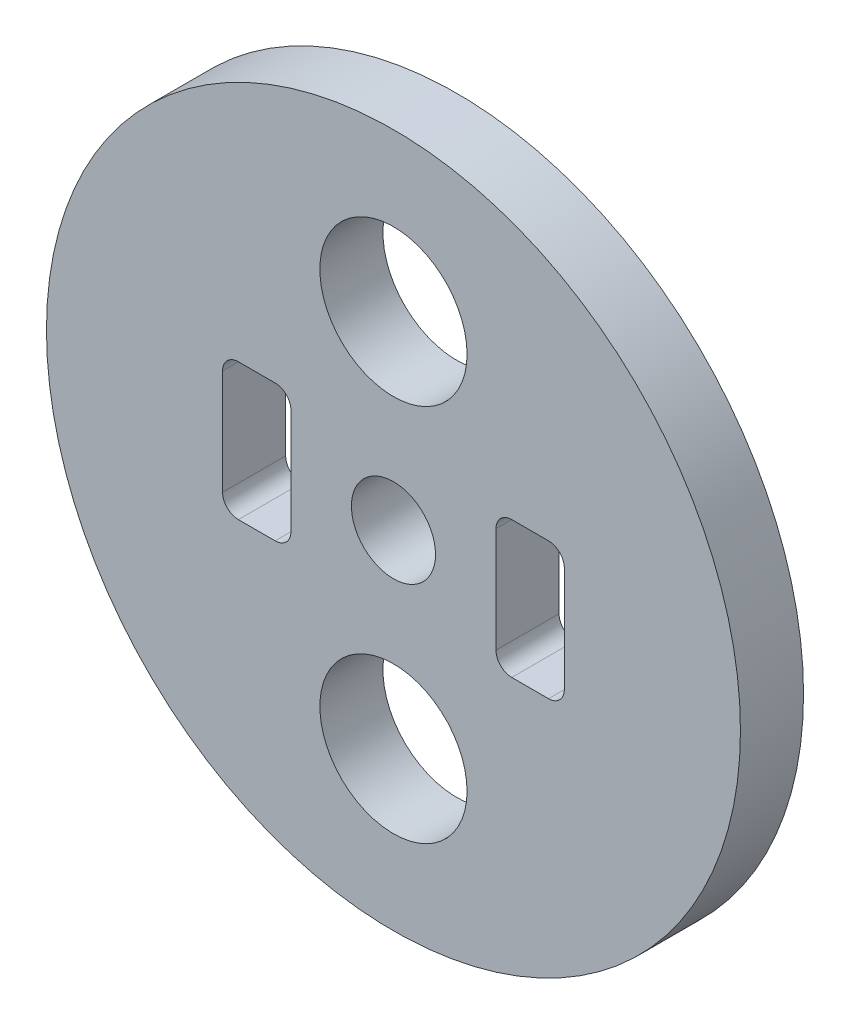
ISO-10303-21;
HEADER;
FILE_DESCRIPTION(('STEP AP214'),'2;1');
FILE_NAME('part.step','',(''),(''),'','','');
FILE_SCHEMA(('AUTOMOTIVE_DESIGN { 1 0 10303 214 1 1 1 1 }'));
ENDSEC;
DATA;
#1=APPLICATION_CONTEXT('core data for automotive mechanical design processes');
#2=APPLICATION_PROTOCOL_DEFINITION('international standard','automotive_design',2000,#1);
#3=PRODUCT_CONTEXT('',#1,'mechanical');
#4=PRODUCT('Part','Part','',(#3));
#5=PRODUCT_RELATED_PRODUCT_CATEGORY('part','',(#4));
#6=PRODUCT_DEFINITION_FORMATION('','',#4);
#7=PRODUCT_DEFINITION_CONTEXT('part definition',#1,'design');
#8=PRODUCT_DEFINITION('design','',#6,#7);
#9=PRODUCT_DEFINITION_SHAPE('','',#8);
#10=(LENGTH_UNIT() NAMED_UNIT(*) SI_UNIT(.MILLI.,.METRE.));
#11=(NAMED_UNIT(*) PLANE_ANGLE_UNIT() SI_UNIT($,.RADIAN.));
#12=(NAMED_UNIT(*) SI_UNIT($,.STERADIAN.) SOLID_ANGLE_UNIT());
#13=UNCERTAINTY_MEASURE_WITH_UNIT(LENGTH_MEASURE(1.E-05),#10,'distance_accuracy_value','');
#14=(GEOMETRIC_REPRESENTATION_CONTEXT(3) GLOBAL_UNCERTAINTY_ASSIGNED_CONTEXT((#13)) GLOBAL_UNIT_ASSIGNED_CONTEXT((#10,
#11,#12)) REPRESENTATION_CONTEXT('',''));
#15=CARTESIAN_POINT('',(0.,0.,0.));
#16=DIRECTION('',(0.,0.,1.));
#17=DIRECTION('',(1.,0.,0.));
#18=AXIS2_PLACEMENT_3D('',#15,#16,#17);
#19=CARTESIAN_POINT('',(210.1228079135,239.4520199932,3.));
#20=DIRECTION('',(0.,0.,-1.));
#21=DIRECTION('',(-1.,0.,0.));
#22=AXIS2_PLACEMENT_3D('',#19,#20,#21);
#23=CYLINDRICAL_SURFACE('',#22,0.750000000000001);
#24=CARTESIAN_POINT('',(210.1228079135,239.4520199932,0.));
#25=DIRECTION('',(0.,0.,1.));
#26=DIRECTION('',(1.,0.,0.));
#27=AXIS2_PLACEMENT_3D('',#24,#25,#26);
#28=CIRCLE('',#27,0.750000000000001);
#29=CARTESIAN_POINT('',(210.1228079135,238.7020199932,0.));
#30=VERTEX_POINT('',#29);
#31=CARTESIAN_POINT('',(210.8728079135,239.4520199932,0.));
#32=VERTEX_POINT('',#31);
#33=EDGE_CURVE('E218',#30,#32,#28,.T.);
#34=ORIENTED_EDGE('',*,*,#33,.F.);
#35=DIRECTION('',(0.,0.,-1.));
#36=VECTOR('',#35,1.);
#37=CARTESIAN_POINT('',(210.1228079135,238.7020199932,3.));
#38=LINE('',#37,#36);
#39=CARTESIAN_POINT('',(210.1228079135,238.7020199932,3.));
#40=VERTEX_POINT('',#39);
#41=EDGE_CURVE('E11',#40,#30,#38,.T.);
#42=ORIENTED_EDGE('',*,*,#41,.F.);
#43=CARTESIAN_POINT('',(210.1228079135,239.4520199932,3.));
#44=DIRECTION('',(0.,0.,1.));
#45=DIRECTION('',(1.,0.,0.));
#46=AXIS2_PLACEMENT_3D('',#43,#44,#45);
#47=CIRCLE('',#46,0.750000000000001);
#48=CARTESIAN_POINT('',(210.8728079135,239.4520199932,3.));
#49=VERTEX_POINT('',#48);
#50=EDGE_CURVE('E302',#40,#49,#47,.T.);
#51=ORIENTED_EDGE('',*,*,#50,.T.);
#52=DIRECTION('',(0.,0.,-1.));
#53=VECTOR('',#52,1.);
#54=CARTESIAN_POINT('',(210.8728079135,239.4520199932,3.));
#55=LINE('',#54,#53);
#56=EDGE_CURVE('E110',#49,#32,#55,.T.);
#57=ORIENTED_EDGE('',*,*,#56,.T.);
#58=EDGE_LOOP('',(#34,#42,#51,#57));
#59=FACE_BOUND('',#58,.T.);
#60=ADVANCED_FACE('F33',(#59),#23,.F.);
#61=CARTESIAN_POINT('',(0.,238.7020199932,3.));
#62=DIRECTION('',(0.,-1.,0.));
#63=DIRECTION('',(0.,0.,-1.));
#64=AXIS2_PLACEMENT_3D('',#61,#62,#63);
#65=PLANE('',#64);
#66=DIRECTION('',(-1.,0.,0.));
#67=VECTOR('',#66,1.);
#68=CARTESIAN_POINT('',(0.,238.7020199932,0.));
#69=LINE('',#68,#67);
#70=CARTESIAN_POINT('',(208.3728079135,238.7020199932,0.));
#71=VERTEX_POINT('',#70);
#72=EDGE_CURVE('E221',#30,#71,#69,.T.);
#73=ORIENTED_EDGE('',*,*,#72,.T.);
#74=DIRECTION('',(0.,0.,-1.));
#75=VECTOR('',#74,1.);
#76=CARTESIAN_POINT('',(208.3728079135,238.7020199932,3.));
#77=LINE('',#76,#75);
#78=CARTESIAN_POINT('',(208.3728079135,238.7020199932,3.));
#79=VERTEX_POINT('',#78);
#80=EDGE_CURVE('E43',#79,#71,#77,.T.);
#81=ORIENTED_EDGE('',*,*,#80,.F.);
#82=DIRECTION('',(-1.,0.,0.));
#83=VECTOR('',#82,1.);
#84=CARTESIAN_POINT('',(0.,238.7020199932,3.));
#85=LINE('',#84,#83);
#86=EDGE_CURVE('E304',#40,#79,#85,.T.);
#87=ORIENTED_EDGE('',*,*,#86,.F.);
#88=ORIENTED_EDGE('',*,*,#41,.T.);
#89=EDGE_LOOP('',(#73,#81,#87,#88));
#90=FACE_BOUND('',#89,.T.);
#91=ADVANCED_FACE('F322',(#90),#65,.F.);
#92=CARTESIAN_POINT('',(208.3728079135,239.4520199932,3.));
#93=DIRECTION('',(0.,0.,-1.));
#94=DIRECTION('',(-1.,0.,0.));
#95=AXIS2_PLACEMENT_3D('',#92,#93,#94);
#96=CYLINDRICAL_SURFACE('',#95,0.750000000000237);
#97=CARTESIAN_POINT('',(208.3728079135,239.4520199932,0.));
#98=DIRECTION('',(0.,0.,1.));
#99=DIRECTION('',(1.,0.,0.));
#100=AXIS2_PLACEMENT_3D('',#97,#98,#99);
#101=CIRCLE('',#100,0.750000000000237);
#102=CARTESIAN_POINT('',(207.6228079135,239.4520199932,0.));
#103=VERTEX_POINT('',#102);
#104=EDGE_CURVE('E224',#103,#71,#101,.T.);
#105=ORIENTED_EDGE('',*,*,#104,.F.);
#106=DIRECTION('',(0.,0.,-1.));
#107=VECTOR('',#106,1.);
#108=CARTESIAN_POINT('',(207.6228079135,239.4520199932,3.));
#109=LINE('',#108,#107);
#110=CARTESIAN_POINT('',(207.6228079135,239.4520199932,3.));
#111=VERTEX_POINT('',#110);
#112=EDGE_CURVE('E247',#111,#103,#109,.T.);
#113=ORIENTED_EDGE('',*,*,#112,.F.);
#114=CARTESIAN_POINT('',(208.3728079135,239.4520199932,3.));
#115=DIRECTION('',(0.,0.,1.));
#116=DIRECTION('',(1.,0.,0.));
#117=AXIS2_PLACEMENT_3D('',#114,#115,#116);
#118=CIRCLE('',#117,0.750000000000237);
#119=EDGE_CURVE('E306',#111,#79,#118,.T.);
#120=ORIENTED_EDGE('',*,*,#119,.T.);
#121=ORIENTED_EDGE('',*,*,#80,.T.);
#122=EDGE_LOOP('',(#105,#113,#120,#121));
#123=FACE_BOUND('',#122,.T.);
#124=ADVANCED_FACE('F325',(#123),#96,.F.);
#125=CARTESIAN_POINT('',(207.6228079135,0.,3.));
#126=DIRECTION('',(-1.,0.,0.));
#127=DIRECTION('',(0.,0.,1.));
#128=AXIS2_PLACEMENT_3D('',#125,#126,#127);
#129=PLANE('',#128);
#130=DIRECTION('',(0.,1.,0.));
#131=VECTOR('',#130,1.);
#132=CARTESIAN_POINT('',(207.6228079135,0.,0.));
#133=LINE('',#132,#131);
#134=CARTESIAN_POINT('',(207.6228079135,244.4520199932,0.));
#135=VERTEX_POINT('',#134);
#136=EDGE_CURVE('E227',#103,#135,#133,.T.);
#137=ORIENTED_EDGE('',*,*,#136,.T.);
#138=DIRECTION('',(0.,0.,-1.));
#139=VECTOR('',#138,1.);
#140=CARTESIAN_POINT('',(207.6228079135,244.4520199932,3.));
#141=LINE('',#140,#139);
#142=CARTESIAN_POINT('',(207.6228079135,244.4520199932,3.));
#143=VERTEX_POINT('',#142);
#144=EDGE_CURVE('E245',#143,#135,#141,.T.);
#145=ORIENTED_EDGE('',*,*,#144,.F.);
#146=DIRECTION('',(0.,1.,0.));
#147=VECTOR('',#146,1.);
#148=CARTESIAN_POINT('',(207.6228079135,0.,3.));
#149=LINE('',#148,#147);
#150=EDGE_CURVE('E309',#111,#143,#149,.T.);
#151=ORIENTED_EDGE('',*,*,#150,.F.);
#152=ORIENTED_EDGE('',*,*,#112,.T.);
#153=EDGE_LOOP('',(#137,#145,#151,#152));
#154=FACE_BOUND('',#153,.T.);
#155=ADVANCED_FACE('F328',(#154),#129,.F.);
#156=CARTESIAN_POINT('',(208.3728079135,244.4520199932,3.));
#157=DIRECTION('',(0.,0.,-1.));
#158=DIRECTION('',(-1.,0.,0.));
#159=AXIS2_PLACEMENT_3D('',#156,#157,#158);
#160=CYLINDRICAL_SURFACE('',#159,0.750000000000001);
#161=CARTESIAN_POINT('',(208.3728079135,244.4520199932,0.));
#162=DIRECTION('',(0.,0.,1.));
#163=DIRECTION('',(1.,0.,0.));
#164=AXIS2_PLACEMENT_3D('',#161,#162,#163);
#165=CIRCLE('',#164,0.750000000000001);
#166=CARTESIAN_POINT('',(208.3728079135,245.2020199932,0.));
#167=VERTEX_POINT('',#166);
#168=EDGE_CURVE('E230',#167,#135,#165,.T.);
#169=ORIENTED_EDGE('',*,*,#168,.F.);
#170=DIRECTION('',(0.,0.,-1.));
#171=VECTOR('',#170,1.);
#172=CARTESIAN_POINT('',(208.3728079135,245.2020199932,3.));
#173=LINE('',#172,#171);
#174=CARTESIAN_POINT('',(208.3728079135,245.2020199932,3.));
#175=VERTEX_POINT('',#174);
#176=EDGE_CURVE('E174',#175,#167,#173,.T.);
#177=ORIENTED_EDGE('',*,*,#176,.F.);
#178=CARTESIAN_POINT('',(208.3728079135,244.4520199932,3.));
#179=DIRECTION('',(0.,0.,1.));
#180=DIRECTION('',(1.,0.,0.));
#181=AXIS2_PLACEMENT_3D('',#178,#179,#180);
#182=CIRCLE('',#181,0.750000000000001);
#183=EDGE_CURVE('E163',#175,#143,#182,.T.);
#184=ORIENTED_EDGE('',*,*,#183,.T.);
#185=ORIENTED_EDGE('',*,*,#144,.T.);
#186=EDGE_LOOP('',(#169,#177,#184,#185));
#187=FACE_BOUND('',#186,.T.);
#188=ADVANCED_FACE('F312',(#187),#160,.F.);
#189=CARTESIAN_POINT('',(0.,245.2020199932,3.));
#190=DIRECTION('',(0.,1.,0.));
#191=DIRECTION('',(0.,0.,1.));
#192=AXIS2_PLACEMENT_3D('',#189,#190,#191);
#193=PLANE('',#192);
#194=DIRECTION('',(1.,0.,0.));
#195=VECTOR('',#194,1.);
#196=CARTESIAN_POINT('',(0.,245.2020199932,0.));
#197=LINE('',#196,#195);
#198=CARTESIAN_POINT('',(210.1228079135,245.2020199932,0.));
#199=VERTEX_POINT('',#198);
#200=EDGE_CURVE('E170',#167,#199,#197,.T.);
#201=ORIENTED_EDGE('',*,*,#200,.T.);
#202=DIRECTION('',(0.,0.,-1.));
#203=VECTOR('',#202,1.);
#204=CARTESIAN_POINT('',(210.1228079135,245.2020199932,3.));
#205=LINE('',#204,#203);
#206=CARTESIAN_POINT('',(210.1228079135,245.2020199932,3.));
#207=VERTEX_POINT('',#206);
#208=EDGE_CURVE('E167',#207,#199,#205,.T.);
#209=ORIENTED_EDGE('',*,*,#208,.F.);
#210=DIRECTION('',(1.,0.,0.));
#211=VECTOR('',#210,1.);
#212=CARTESIAN_POINT('',(0.,245.2020199932,3.));
#213=LINE('',#212,#211);
#214=EDGE_CURVE('E156',#175,#207,#213,.T.);
#215=ORIENTED_EDGE('',*,*,#214,.F.);
#216=ORIENTED_EDGE('',*,*,#176,.T.);
#217=EDGE_LOOP('',(#201,#209,#215,#216));
#218=FACE_BOUND('',#217,.T.);
#219=ADVANCED_FACE('F168',(#218),#193,.F.);
#220=CARTESIAN_POINT('',(210.1228079135,244.4520199932,3.));
#221=DIRECTION('',(0.,0.,-1.));
#222=DIRECTION('',(-1.,0.,0.));
#223=AXIS2_PLACEMENT_3D('',#220,#221,#222);
#224=CYLINDRICAL_SURFACE('',#223,0.750000000000001);
#225=CARTESIAN_POINT('',(210.1228079135,244.4520199932,0.));
#226=DIRECTION('',(0.,0.,1.));
#227=DIRECTION('',(1.,0.,0.));
#228=AXIS2_PLACEMENT_3D('',#225,#226,#227);
#229=CIRCLE('',#228,0.750000000000001);
#230=CARTESIAN_POINT('',(210.8728079135,244.4520199932,0.));
#231=VERTEX_POINT('',#230);
#232=EDGE_CURVE('E234',#231,#199,#229,.T.);
#233=ORIENTED_EDGE('',*,*,#232,.F.);
#234=DIRECTION('',(0.,0.,-1.));
#235=VECTOR('',#234,1.);
#236=CARTESIAN_POINT('',(210.8728079135,244.4520199932,3.));
#237=LINE('',#236,#235);
#238=CARTESIAN_POINT('',(210.8728079135,244.4520199932,3.));
#239=VERTEX_POINT('',#238);
#240=EDGE_CURVE('E103',#239,#231,#237,.T.);
#241=ORIENTED_EDGE('',*,*,#240,.F.);
#242=CARTESIAN_POINT('',(210.1228079135,244.4520199932,3.));
#243=DIRECTION('',(0.,0.,1.));
#244=DIRECTION('',(1.,0.,0.));
#245=AXIS2_PLACEMENT_3D('',#242,#243,#244);
#246=CIRCLE('',#245,0.750000000000001);
#247=EDGE_CURVE('E161',#239,#207,#246,.T.);
#248=ORIENTED_EDGE('',*,*,#247,.T.);
#249=ORIENTED_EDGE('',*,*,#208,.T.);
#250=EDGE_LOOP('',(#233,#241,#248,#249));
#251=FACE_BOUND('',#250,.T.);
#252=ADVANCED_FACE('F176',(#251),#224,.F.);
#253=CARTESIAN_POINT('',(221.3728079135,239.4520199932,3.));
#254=DIRECTION('',(0.,0.,-1.));
#255=DIRECTION('',(-1.,0.,0.));
#256=AXIS2_PLACEMENT_3D('',#253,#254,#255);
#257=CYLINDRICAL_SURFACE('',#256,0.750000000000001);
#258=CARTESIAN_POINT('',(221.3728079135,239.4520199932,0.));
#259=DIRECTION('',(0.,0.,1.));
#260=DIRECTION('',(1.,0.,0.));
#261=AXIS2_PLACEMENT_3D('',#258,#259,#260);
#262=CIRCLE('',#261,0.750000000000001);
#263=CARTESIAN_POINT('',(220.6228079135,239.4520199932,0.));
#264=VERTEX_POINT('',#263);
#265=CARTESIAN_POINT('',(221.3728079135,238.7020199932,0.));
#266=VERTEX_POINT('',#265);
#267=EDGE_CURVE('E194',#264,#266,#262,.T.);
#268=ORIENTED_EDGE('',*,*,#267,.F.);
#269=DIRECTION('',(0.,0.,-1.));
#270=VECTOR('',#269,1.);
#271=CARTESIAN_POINT('',(220.6228079135,239.4520199932,3.));
#272=LINE('',#271,#270);
#273=CARTESIAN_POINT('',(220.6228079135,239.4520199932,3.));
#274=VERTEX_POINT('',#273);
#275=EDGE_CURVE('E37',#274,#264,#272,.T.);
#276=ORIENTED_EDGE('',*,*,#275,.F.);
#277=CARTESIAN_POINT('',(221.3728079135,239.4520199932,3.));
#278=DIRECTION('',(0.,0.,1.));
#279=DIRECTION('',(1.,0.,0.));
#280=AXIS2_PLACEMENT_3D('',#277,#278,#279);
#281=CIRCLE('',#280,0.750000000000001);
#282=CARTESIAN_POINT('',(221.3728079135,238.7020199932,3.));
#283=VERTEX_POINT('',#282);
#284=EDGE_CURVE('E541',#274,#283,#281,.T.);
#285=ORIENTED_EDGE('',*,*,#284,.T.);
#286=DIRECTION('',(0.,0.,-1.));
#287=VECTOR('',#286,1.);
#288=CARTESIAN_POINT('',(221.3728079135,238.7020199932,3.));
#289=LINE('',#288,#287);
#290=EDGE_CURVE('E184',#283,#266,#289,.T.);
#291=ORIENTED_EDGE('',*,*,#290,.T.);
#292=EDGE_LOOP('',(#268,#276,#285,#291));
#293=FACE_BOUND('',#292,.T.);
#294=ADVANCED_FACE('F270',(#293),#257,.F.);
#295=CARTESIAN_POINT('',(220.6228079135,0.,3.));
#296=DIRECTION('',(1.,0.,0.));
#297=DIRECTION('',(0.,0.,-1.));
#298=AXIS2_PLACEMENT_3D('',#295,#296,#297);
#299=PLANE('',#298);
#300=DIRECTION('',(0.,-1.,0.));
#301=VECTOR('',#300,1.);
#302=CARTESIAN_POINT('',(220.6228079135,0.,0.));
#303=LINE('',#302,#301);
#304=CARTESIAN_POINT('',(220.6228079135,244.4520199932,0.));
#305=VERTEX_POINT('',#304);
#306=EDGE_CURVE('E197',#305,#264,#303,.T.);
#307=ORIENTED_EDGE('',*,*,#306,.F.);
#308=DIRECTION('',(0.,0.,-1.));
#309=VECTOR('',#308,1.);
#310=CARTESIAN_POINT('',(220.6228079135,244.4520199932,3.));
#311=LINE('',#310,#309);
#312=CARTESIAN_POINT('',(220.6228079135,244.4520199932,3.));
#313=VERTEX_POINT('',#312);
#314=EDGE_CURVE('E260',#313,#305,#311,.T.);
#315=ORIENTED_EDGE('',*,*,#314,.F.);
#316=DIRECTION('',(0.,-1.,0.));
#317=VECTOR('',#316,1.);
#318=CARTESIAN_POINT('',(220.6228079135,0.,3.));
#319=LINE('',#318,#317);
#320=EDGE_CURVE('E269',#313,#274,#319,.T.);
#321=ORIENTED_EDGE('',*,*,#320,.T.);
#322=ORIENTED_EDGE('',*,*,#275,.T.);
#323=EDGE_LOOP('',(#307,#315,#321,#322));
#324=FACE_BOUND('',#323,.T.);
#325=ADVANCED_FACE('F267',(#324),#299,.T.);
#326=CARTESIAN_POINT('',(221.3728079135,244.4520199932,3.));
#327=DIRECTION('',(0.,0.,-1.));
#328=DIRECTION('',(-1.,0.,0.));
#329=AXIS2_PLACEMENT_3D('',#326,#327,#328);
#330=CYLINDRICAL_SURFACE('',#329,0.750000000000001);
#331=CARTESIAN_POINT('',(221.3728079135,244.4520199932,0.));
#332=DIRECTION('',(0.,0.,1.));
#333=DIRECTION('',(1.,0.,0.));
#334=AXIS2_PLACEMENT_3D('',#331,#332,#333);
#335=CIRCLE('',#334,0.750000000000001);
#336=CARTESIAN_POINT('',(221.3728079135,245.2020199932,0.));
#337=VERTEX_POINT('',#336);
#338=EDGE_CURVE('E200',#337,#305,#335,.T.);
#339=ORIENTED_EDGE('',*,*,#338,.F.);
#340=DIRECTION('',(0.,0.,-1.));
#341=VECTOR('',#340,1.);
#342=CARTESIAN_POINT('',(221.3728079135,245.2020199932,3.));
#343=LINE('',#342,#341);
#344=CARTESIAN_POINT('',(221.3728079135,245.2020199932,3.));
#345=VERTEX_POINT('',#344);
#346=EDGE_CURVE('E259',#345,#337,#343,.T.);
#347=ORIENTED_EDGE('',*,*,#346,.F.);
#348=CARTESIAN_POINT('',(221.3728079135,244.4520199932,3.));
#349=DIRECTION('',(0.,0.,1.));
#350=DIRECTION('',(1.,0.,0.));
#351=AXIS2_PLACEMENT_3D('',#348,#349,#350);
#352=CIRCLE('',#351,0.750000000000001);
#353=EDGE_CURVE('E278',#345,#313,#352,.T.);
#354=ORIENTED_EDGE('',*,*,#353,.T.);
#355=ORIENTED_EDGE('',*,*,#314,.T.);
#356=EDGE_LOOP('',(#339,#347,#354,#355));
#357=FACE_BOUND('',#356,.T.);
#358=ADVANCED_FACE('F276',(#357),#330,.F.);
#359=CARTESIAN_POINT('',(0.,245.2020199932,3.));
#360=DIRECTION('',(0.,-1.,0.));
#361=DIRECTION('',(0.,0.,-1.));
#362=AXIS2_PLACEMENT_3D('',#359,#360,#361);
#363=PLANE('',#362);
#364=DIRECTION('',(-1.,0.,0.));
#365=VECTOR('',#364,1.);
#366=CARTESIAN_POINT('',(0.,245.2020199932,0.));
#367=LINE('',#366,#365);
#368=CARTESIAN_POINT('',(223.1228079135,245.2020199932,0.));
#369=VERTEX_POINT('',#368);
#370=EDGE_CURVE('E203',#369,#337,#367,.T.);
#371=ORIENTED_EDGE('',*,*,#370,.F.);
#372=DIRECTION('',(0.,0.,-1.));
#373=VECTOR('',#372,1.);
#374=CARTESIAN_POINT('',(223.1228079135,245.2020199932,3.));
#375=LINE('',#374,#373);
#376=CARTESIAN_POINT('',(223.1228079135,245.2020199932,3.));
#377=VERTEX_POINT('',#376);
#378=EDGE_CURVE('E257',#377,#369,#375,.T.);
#379=ORIENTED_EDGE('',*,*,#378,.F.);
#380=DIRECTION('',(-1.,0.,0.));
#381=VECTOR('',#380,1.);
#382=CARTESIAN_POINT('',(0.,245.2020199932,3.));
#383=LINE('',#382,#381);
#384=EDGE_CURVE('E284',#377,#345,#383,.T.);
#385=ORIENTED_EDGE('',*,*,#384,.T.);
#386=ORIENTED_EDGE('',*,*,#346,.T.);
#387=EDGE_LOOP('',(#371,#379,#385,#386));
#388=FACE_BOUND('',#387,.T.);
#389=ADVANCED_FACE('F287',(#388),#363,.T.);
#390=CARTESIAN_POINT('',(223.1228079135,244.4520199932,3.));
#391=DIRECTION('',(0.,0.,-1.));
#392=DIRECTION('',(-1.,0.,0.));
#393=AXIS2_PLACEMENT_3D('',#390,#391,#392);
#394=CYLINDRICAL_SURFACE('',#393,0.750000000000001);
#395=CARTESIAN_POINT('',(223.1228079135,244.4520199932,0.));
#396=DIRECTION('',(0.,0.,1.));
#397=DIRECTION('',(1.,0.,0.));
#398=AXIS2_PLACEMENT_3D('',#395,#396,#397);
#399=CIRCLE('',#398,0.750000000000001);
#400=CARTESIAN_POINT('',(223.8728079135,244.4520199932,0.));
#401=VERTEX_POINT('',#400);
#402=EDGE_CURVE('E206',#401,#369,#399,.T.);
#403=ORIENTED_EDGE('',*,*,#402,.F.);
#404=DIRECTION('',(0.,0.,-1.));
#405=VECTOR('',#404,1.);
#406=CARTESIAN_POINT('',(223.8728079135,244.4520199932,3.));
#407=LINE('',#406,#405);
#408=CARTESIAN_POINT('',(223.8728079135,244.4520199932,3.));
#409=VERTEX_POINT('',#408);
#410=EDGE_CURVE('E255',#409,#401,#407,.T.);
#411=ORIENTED_EDGE('',*,*,#410,.F.);
#412=CARTESIAN_POINT('',(223.1228079135,244.4520199932,3.));
#413=DIRECTION('',(0.,0.,1.));
#414=DIRECTION('',(1.,0.,0.));
#415=AXIS2_PLACEMENT_3D('',#412,#413,#414);
#416=CIRCLE('',#415,0.750000000000001);
#417=EDGE_CURVE('E288',#409,#377,#416,.T.);
#418=ORIENTED_EDGE('',*,*,#417,.T.);
#419=ORIENTED_EDGE('',*,*,#378,.T.);
#420=EDGE_LOOP('',(#403,#411,#418,#419));
#421=FACE_BOUND('',#420,.T.);
#422=ADVANCED_FACE('F356',(#421),#394,.F.);
#423=CARTESIAN_POINT('',(223.8728079135,0.,3.));
#424=DIRECTION('',(-1.,0.,0.));
#425=DIRECTION('',(0.,0.,1.));
#426=AXIS2_PLACEMENT_3D('',#423,#424,#425);
#427=PLANE('',#426);
#428=DIRECTION('',(0.,1.,0.));
#429=VECTOR('',#428,1.);
#430=CARTESIAN_POINT('',(223.8728079135,0.,0.));
#431=LINE('',#430,#429);
#432=CARTESIAN_POINT('',(223.8728079135,239.4520199932,0.));
#433=VERTEX_POINT('',#432);
#434=EDGE_CURVE('E209',#433,#401,#431,.T.);
#435=ORIENTED_EDGE('',*,*,#434,.F.);
#436=DIRECTION('',(0.,0.,-1.));
#437=VECTOR('',#436,1.);
#438=CARTESIAN_POINT('',(223.8728079135,239.4520199932,3.));
#439=LINE('',#438,#437);
#440=CARTESIAN_POINT('',(223.8728079135,239.4520199932,3.));
#441=VERTEX_POINT('',#440);
#442=EDGE_CURVE('E253',#441,#433,#439,.T.);
#443=ORIENTED_EDGE('',*,*,#442,.F.);
#444=DIRECTION('',(0.,1.,0.));
#445=VECTOR('',#444,1.);
#446=CARTESIAN_POINT('',(223.8728079135,0.,3.));
#447=LINE('',#446,#445);
#448=EDGE_CURVE('E290',#441,#409,#447,.T.);
#449=ORIENTED_EDGE('',*,*,#448,.T.);
#450=ORIENTED_EDGE('',*,*,#410,.T.);
#451=EDGE_LOOP('',(#435,#443,#449,#450));
#452=FACE_BOUND('',#451,.T.);
#453=ADVANCED_FACE('F352',(#452),#427,.T.);
#454=CARTESIAN_POINT('',(223.1228079135,239.4520199932,3.));
#455=DIRECTION('',(0.,0.,-1.));
#456=DIRECTION('',(-1.,0.,0.));
#457=AXIS2_PLACEMENT_3D('',#454,#455,#456);
#458=CYLINDRICAL_SURFACE('',#457,0.750000000000001);
#459=CARTESIAN_POINT('',(223.1228079135,239.4520199932,0.));
#460=DIRECTION('',(0.,0.,1.));
#461=DIRECTION('',(1.,0.,0.));
#462=AXIS2_PLACEMENT_3D('',#459,#460,#461);
#463=CIRCLE('',#462,0.750000000000001);
#464=CARTESIAN_POINT('',(223.1228079135,238.7020199932,0.));
#465=VERTEX_POINT('',#464);
#466=EDGE_CURVE('E212',#465,#433,#463,.T.);
#467=ORIENTED_EDGE('',*,*,#466,.F.);
#468=DIRECTION('',(0.,0.,-1.));
#469=VECTOR('',#468,1.);
#470=CARTESIAN_POINT('',(223.1228079135,238.7020199932,3.));
#471=LINE('',#470,#469);
#472=CARTESIAN_POINT('',(223.1228079135,238.7020199932,3.));
#473=VERTEX_POINT('',#472);
#474=EDGE_CURVE('E251',#473,#465,#471,.T.);
#475=ORIENTED_EDGE('',*,*,#474,.F.);
#476=CARTESIAN_POINT('',(223.1228079135,239.4520199932,3.));
#477=DIRECTION('',(0.,0.,1.));
#478=DIRECTION('',(1.,0.,0.));
#479=AXIS2_PLACEMENT_3D('',#476,#477,#478);
#480=CIRCLE('',#479,0.750000000000001);
#481=EDGE_CURVE('E296',#473,#441,#480,.T.);
#482=ORIENTED_EDGE('',*,*,#481,.T.);
#483=ORIENTED_EDGE('',*,*,#442,.T.);
#484=EDGE_LOOP('',(#467,#475,#482,#483));
#485=FACE_BOUND('',#484,.T.);
#486=ADVANCED_FACE('F349',(#485),#458,.F.);
#487=CARTESIAN_POINT('',(210.8728079135,0.,3.));
#488=DIRECTION('',(1.,0.,0.));
#489=DIRECTION('',(0.,0.,-1.));
#490=AXIS2_PLACEMENT_3D('',#487,#488,#489);
#491=PLANE('',#490);
#492=DIRECTION('',(0.,-1.,0.));
#493=VECTOR('',#492,1.);
#494=CARTESIAN_POINT('',(210.8728079135,0.,0.));
#495=LINE('',#494,#493);
#496=EDGE_CURVE('E236',#231,#32,#495,.T.);
#497=ORIENTED_EDGE('',*,*,#496,.T.);
#498=ORIENTED_EDGE('',*,*,#56,.F.);
#499=DIRECTION('',(0.,-1.,0.));
#500=VECTOR('',#499,1.);
#501=CARTESIAN_POINT('',(210.8728079135,0.,3.));
#502=LINE('',#501,#500);
#503=EDGE_CURVE('E52',#239,#49,#502,.T.);
#504=ORIENTED_EDGE('',*,*,#503,.F.);
#505=ORIENTED_EDGE('',*,*,#240,.T.);
#506=EDGE_LOOP('',(#497,#498,#504,#505));
#507=FACE_BOUND('',#506,.T.);
#508=ADVANCED_FACE('F317',(#507),#491,.F.);
#509=CARTESIAN_POINT('',(0.,238.7020199932,3.));
#510=DIRECTION('',(0.,1.,0.));
#511=DIRECTION('',(0.,0.,1.));
#512=AXIS2_PLACEMENT_3D('',#509,#510,#511);
#513=PLANE('',#512);
#514=DIRECTION('',(1.,0.,0.));
#515=VECTOR('',#514,1.);
#516=CARTESIAN_POINT('',(0.,238.7020199932,0.));
#517=LINE('',#516,#515);
#518=EDGE_CURVE('E215',#266,#465,#517,.T.);
#519=ORIENTED_EDGE('',*,*,#518,.F.);
#520=ORIENTED_EDGE('',*,*,#290,.F.);
#521=DIRECTION('',(1.,0.,0.));
#522=VECTOR('',#521,1.);
#523=CARTESIAN_POINT('',(0.,238.7020199932,3.));
#524=LINE('',#523,#522);
#525=EDGE_CURVE('E299',#283,#473,#524,.T.);
#526=ORIENTED_EDGE('',*,*,#525,.T.);
#527=ORIENTED_EDGE('',*,*,#474,.T.);
#528=EDGE_LOOP('',(#519,#520,#526,#527));
#529=FACE_BOUND('',#528,.T.);
#530=ADVANCED_FACE('F344',(#529),#513,.T.);
#531=CARTESIAN_POINT('',(215.7478079135,241.9520199932,3.));
#532=DIRECTION('',(0.,0.,-1.));
#533=DIRECTION('',(-1.,0.,0.));
#534=AXIS2_PLACEMENT_3D('',#531,#532,#533);
#535=CYLINDRICAL_SURFACE('',#534,2.);
#536=CARTESIAN_POINT('',(215.7478079135,241.9520199932,3.));
#537=DIRECTION('',(0.,0.,1.));
#538=DIRECTION('',(1.,0.,0.));
#539=AXIS2_PLACEMENT_3D('',#536,#537,#538);
#540=CIRCLE('',#539,2.);
#541=CARTESIAN_POINT('',(217.7478079135,241.9520199932,3.));
#542=VERTEX_POINT('',#541);
#543=EDGE_CURVE('E540',#542,#542,#540,.T.);
#544=ORIENTED_EDGE('',*,*,#543,.T.);
#545=EDGE_LOOP('',(#544));
#546=FACE_BOUND('',#545,.T.);
#547=CARTESIAN_POINT('',(215.7478079135,241.9520199932,0.));
#548=DIRECTION('',(0.,0.,1.));
#549=DIRECTION('',(1.,0.,0.));
#550=AXIS2_PLACEMENT_3D('',#547,#548,#549);
#551=CIRCLE('',#550,2.);
#552=CARTESIAN_POINT('',(217.7478079135,241.9520199932,0.));
#553=VERTEX_POINT('',#552);
#554=EDGE_CURVE('E191',#553,#553,#551,.T.);
#555=ORIENTED_EDGE('',*,*,#554,.F.);
#556=EDGE_LOOP('',(#555));
#557=FACE_BOUND('',#556,.T.);
#558=ADVANCED_FACE('F347',(#546,#557),#535,.F.);
#559=CARTESIAN_POINT('',(215.7478079135,250.9520199932,3.));
#560=DIRECTION('',(0.,0.,-1.));
#561=DIRECTION('',(-1.,0.,0.));
#562=AXIS2_PLACEMENT_3D('',#559,#560,#561);
#563=CYLINDRICAL_SURFACE('',#562,3.5);
#564=CARTESIAN_POINT('',(215.7478079135,250.9520199932,3.));
#565=DIRECTION('',(0.,0.,1.));
#566=DIRECTION('',(1.,0.,0.));
#567=AXIS2_PLACEMENT_3D('',#564,#565,#566);
#568=CIRCLE('',#567,3.5);
#569=CARTESIAN_POINT('',(219.2478079135,250.9520199932,3.));
#570=VERTEX_POINT('',#569);
#571=EDGE_CURVE('E382',#570,#570,#568,.T.);
#572=ORIENTED_EDGE('',*,*,#571,.T.);
#573=EDGE_LOOP('',(#572));
#574=FACE_BOUND('',#573,.T.);
#575=CARTESIAN_POINT('',(215.7478079135,250.9520199932,0.));
#576=DIRECTION('',(0.,0.,1.));
#577=DIRECTION('',(1.,0.,0.));
#578=AXIS2_PLACEMENT_3D('',#575,#576,#577);
#579=CIRCLE('',#578,3.5);
#580=CARTESIAN_POINT('',(219.2478079135,250.9520199932,0.));
#581=VERTEX_POINT('',#580);
#582=EDGE_CURVE('E188',#581,#581,#579,.T.);
#583=ORIENTED_EDGE('',*,*,#582,.F.);
#584=EDGE_LOOP('',(#583));
#585=FACE_BOUND('',#584,.T.);
#586=ADVANCED_FACE('F370',(#574,#585),#563,.F.);
#587=CARTESIAN_POINT('',(215.7478079135,232.9520199932,3.));
#588=DIRECTION('',(0.,0.,-1.));
#589=DIRECTION('',(-1.,0.,0.));
#590=AXIS2_PLACEMENT_3D('',#587,#588,#589);
#591=CYLINDRICAL_SURFACE('',#590,3.5);
#592=CARTESIAN_POINT('',(215.7478079135,232.9520199932,3.));
#593=DIRECTION('',(0.,0.,1.));
#594=DIRECTION('',(1.,0.,0.));
#595=AXIS2_PLACEMENT_3D('',#592,#593,#594);
#596=CIRCLE('',#595,3.5);
#597=CARTESIAN_POINT('',(219.2478079135,232.9520199932,3.));
#598=VERTEX_POINT('',#597);
#599=EDGE_CURVE('E241',#598,#598,#596,.T.);
#600=ORIENTED_EDGE('',*,*,#599,.T.);
#601=EDGE_LOOP('',(#600));
#602=FACE_BOUND('',#601,.T.);
#603=CARTESIAN_POINT('',(215.7478079135,232.9520199932,0.));
#604=DIRECTION('',(0.,0.,1.));
#605=DIRECTION('',(1.,0.,0.));
#606=AXIS2_PLACEMENT_3D('',#603,#604,#605);
#607=CIRCLE('',#606,3.5);
#608=CARTESIAN_POINT('',(219.2478079135,232.9520199932,0.));
#609=VERTEX_POINT('',#608);
#610=EDGE_CURVE('E185',#609,#609,#607,.T.);
#611=ORIENTED_EDGE('',*,*,#610,.F.);
#612=EDGE_LOOP('',(#611));
#613=FACE_BOUND('',#612,.T.);
#614=ADVANCED_FACE('F35',(#602,#613),#591,.F.);
#615=CARTESIAN_POINT('',(215.7478079135,241.9520199932,3.));
#616=DIRECTION('',(0.,0.,-1.));
#617=DIRECTION('',(-1.,0.,0.));
#618=AXIS2_PLACEMENT_3D('',#615,#616,#617);
#619=CYLINDRICAL_SURFACE('',#618,16.5);
#620=CARTESIAN_POINT('',(215.7478079135,241.9520199932,3.));
#621=DIRECTION('',(0.,0.,1.));
#622=DIRECTION('',(1.,0.,0.));
#623=AXIS2_PLACEMENT_3D('',#620,#621,#622);
#624=CIRCLE('',#623,16.5);
#625=CARTESIAN_POINT('',(232.2478079135,241.9520199932,3.));
#626=VERTEX_POINT('',#625);
#627=EDGE_CURVE('E178',#626,#626,#624,.T.);
#628=ORIENTED_EDGE('',*,*,#627,.F.);
#629=EDGE_LOOP('',(#628));
#630=FACE_BOUND('',#629,.T.);
#631=CARTESIAN_POINT('',(215.7478079135,241.9520199932,0.));
#632=DIRECTION('',(0.,0.,1.));
#633=DIRECTION('',(1.,0.,0.));
#634=AXIS2_PLACEMENT_3D('',#631,#632,#633);
#635=CIRCLE('',#634,16.5);
#636=CARTESIAN_POINT('',(232.2478079135,241.9520199932,0.));
#637=VERTEX_POINT('',#636);
#638=EDGE_CURVE('E238',#637,#637,#635,.T.);
#639=ORIENTED_EDGE('',*,*,#638,.T.);
#640=EDGE_LOOP('',(#639));
#641=FACE_BOUND('',#640,.T.);
#642=ADVANCED_FACE('F377',(#630,#641),#619,.T.);
#643=CARTESIAN_POINT('',(0.,0.,3.));
#644=DIRECTION('',(0.,0.,1.));
#645=DIRECTION('',(1.,0.,0.));
#646=AXIS2_PLACEMENT_3D('',#643,#644,#645);
#647=PLANE('',#646);
#648=ORIENTED_EDGE('',*,*,#599,.F.);
#649=EDGE_LOOP('',(#648));
#650=FACE_BOUND('',#649,.T.);
#651=ORIENTED_EDGE('',*,*,#571,.F.);
#652=EDGE_LOOP('',(#651));
#653=FACE_BOUND('',#652,.T.);
#654=ORIENTED_EDGE('',*,*,#543,.F.);
#655=EDGE_LOOP('',(#654));
#656=FACE_BOUND('',#655,.T.);
#657=ORIENTED_EDGE('',*,*,#284,.F.);
#658=ORIENTED_EDGE('',*,*,#320,.F.);
#659=ORIENTED_EDGE('',*,*,#353,.F.);
#660=ORIENTED_EDGE('',*,*,#384,.F.);
#661=ORIENTED_EDGE('',*,*,#417,.F.);
#662=ORIENTED_EDGE('',*,*,#448,.F.);
#663=ORIENTED_EDGE('',*,*,#481,.F.);
#664=ORIENTED_EDGE('',*,*,#525,.F.);
#665=EDGE_LOOP('',(#657,#658,#659,#660,#661,#662,#663,#664));
#666=FACE_BOUND('',#665,.T.);
#667=ORIENTED_EDGE('',*,*,#50,.F.);
#668=ORIENTED_EDGE('',*,*,#86,.T.);
#669=ORIENTED_EDGE('',*,*,#119,.F.);
#670=ORIENTED_EDGE('',*,*,#150,.T.);
#671=ORIENTED_EDGE('',*,*,#183,.F.);
#672=ORIENTED_EDGE('',*,*,#214,.T.);
#673=ORIENTED_EDGE('',*,*,#247,.F.);
#674=ORIENTED_EDGE('',*,*,#503,.T.);
#675=EDGE_LOOP('',(#667,#668,#669,#670,#671,#672,#673,#674));
#676=FACE_BOUND('',#675,.T.);
#677=ORIENTED_EDGE('',*,*,#627,.T.);
#678=EDGE_LOOP('',(#677));
#679=FACE_BOUND('',#678,.T.);
#680=ADVANCED_FACE('F158',(#650,#653,#656,#666,#676,#679),#647,.T.);
#681=CARTESIAN_POINT('',(0.,0.,0.));
#682=DIRECTION('',(0.,0.,1.));
#683=DIRECTION('',(1.,0.,0.));
#684=AXIS2_PLACEMENT_3D('',#681,#682,#683);
#685=PLANE('',#684);
#686=ORIENTED_EDGE('',*,*,#610,.T.);
#687=EDGE_LOOP('',(#686));
#688=FACE_BOUND('',#687,.T.);
#689=ORIENTED_EDGE('',*,*,#582,.T.);
#690=EDGE_LOOP('',(#689));
#691=FACE_BOUND('',#690,.T.);
#692=ORIENTED_EDGE('',*,*,#554,.T.);
#693=EDGE_LOOP('',(#692));
#694=FACE_BOUND('',#693,.T.);
#695=ORIENTED_EDGE('',*,*,#267,.T.);
#696=ORIENTED_EDGE('',*,*,#518,.T.);
#697=ORIENTED_EDGE('',*,*,#466,.T.);
#698=ORIENTED_EDGE('',*,*,#434,.T.);
#699=ORIENTED_EDGE('',*,*,#402,.T.);
#700=ORIENTED_EDGE('',*,*,#370,.T.);
#701=ORIENTED_EDGE('',*,*,#338,.T.);
#702=ORIENTED_EDGE('',*,*,#306,.T.);
#703=EDGE_LOOP('',(#695,#696,#697,#698,#699,#700,#701,#702));
#704=FACE_BOUND('',#703,.T.);
#705=ORIENTED_EDGE('',*,*,#33,.T.);
#706=ORIENTED_EDGE('',*,*,#496,.F.);
#707=ORIENTED_EDGE('',*,*,#232,.T.);
#708=ORIENTED_EDGE('',*,*,#200,.F.);
#709=ORIENTED_EDGE('',*,*,#168,.T.);
#710=ORIENTED_EDGE('',*,*,#136,.F.);
#711=ORIENTED_EDGE('',*,*,#104,.T.);
#712=ORIENTED_EDGE('',*,*,#72,.F.);
#713=EDGE_LOOP('',(#705,#706,#707,#708,#709,#710,#711,#712));
#714=FACE_BOUND('',#713,.T.);
#715=ORIENTED_EDGE('',*,*,#638,.F.);
#716=EDGE_LOOP('',(#715));
#717=FACE_BOUND('',#716,.T.);
#718=ADVANCED_FACE('F273',(#688,#691,#694,#704,#714,#717),#685,.F.);
#719=CLOSED_SHELL('',(#60,#91,#124,#155,#188,#219,#252,#294,#325,#358,#389,#422,#453,#486,#508,
#530,#558,#586,#614,#642,#680,#718));
#720=MANIFOLD_SOLID_BREP('B2',#719);
#721=ADVANCED_BREP_SHAPE_REPRESENTATION('',(#18,#720),#14);
#722=SHAPE_DEFINITION_REPRESENTATION(#9,#721);
ENDSEC;
END-ISO-10303-21;
